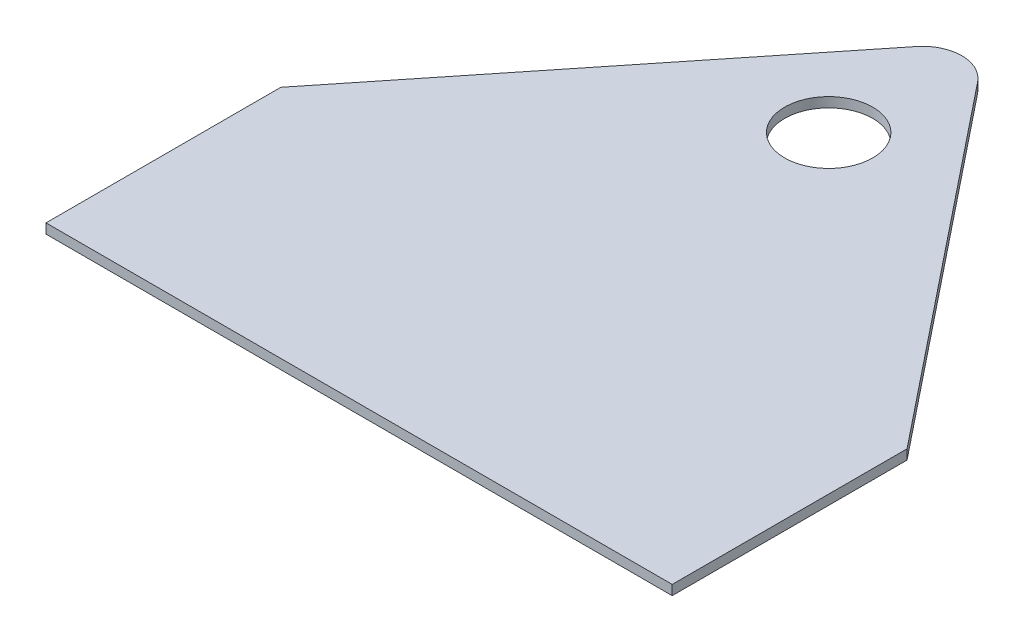
ISO-10303-21;
HEADER;
FILE_DESCRIPTION(('STEP AP214'),'2;1');
FILE_NAME('part.step','',(''),(''),'','','');
FILE_SCHEMA(('AUTOMOTIVE_DESIGN { 1 0 10303 214 1 1 1 1 }'));
ENDSEC;
DATA;
#1=APPLICATION_CONTEXT('core data for automotive mechanical design processes');
#2=APPLICATION_PROTOCOL_DEFINITION('international standard','automotive_design',2000,#1);
#3=PRODUCT_CONTEXT('',#1,'mechanical');
#4=PRODUCT('Part','Part','',(#3));
#5=PRODUCT_RELATED_PRODUCT_CATEGORY('part','',(#4));
#6=PRODUCT_DEFINITION_FORMATION('','',#4);
#7=PRODUCT_DEFINITION_CONTEXT('part definition',#1,'design');
#8=PRODUCT_DEFINITION('design','',#6,#7);
#9=PRODUCT_DEFINITION_SHAPE('','',#8);
#10=(LENGTH_UNIT() NAMED_UNIT(*) SI_UNIT(.MILLI.,.METRE.));
#11=(NAMED_UNIT(*) PLANE_ANGLE_UNIT() SI_UNIT($,.RADIAN.));
#12=(NAMED_UNIT(*) SI_UNIT($,.STERADIAN.) SOLID_ANGLE_UNIT());
#13=UNCERTAINTY_MEASURE_WITH_UNIT(LENGTH_MEASURE(1.E-05),#10,'distance_accuracy_value','');
#14=(GEOMETRIC_REPRESENTATION_CONTEXT(3) GLOBAL_UNCERTAINTY_ASSIGNED_CONTEXT((#13)) GLOBAL_UNIT_ASSIGNED_CONTEXT((#10,
#11,#12)) REPRESENTATION_CONTEXT('',''));
#15=CARTESIAN_POINT('',(0.,0.,0.));
#16=DIRECTION('',(0.,0.,1.));
#17=DIRECTION('',(1.,0.,0.));
#18=AXIS2_PLACEMENT_3D('',#15,#16,#17);
#19=CARTESIAN_POINT('',(101.6,1.5875,-76.2));
#20=DIRECTION('',(-1.,0.,0.));
#21=DIRECTION('',(0.,0.,1.));
#22=AXIS2_PLACEMENT_3D('',#19,#20,#21);
#23=PLANE('',#22);
#24=DIRECTION('',(0.,0.,-1.));
#25=VECTOR('',#24,1.);
#26=CARTESIAN_POINT('',(101.6,-1.5875,-76.2));
#27=LINE('',#26,#25);
#28=CARTESIAN_POINT('',(101.6,-1.5875,0.));
#29=VERTEX_POINT('',#28);
#30=CARTESIAN_POINT('',(101.6,-1.5875,-76.2));
#31=VERTEX_POINT('',#30);
#32=EDGE_CURVE('E116',#29,#31,#27,.T.);
#33=ORIENTED_EDGE('',*,*,#32,.T.);
#34=DIRECTION('',(0.,-1.,0.));
#35=VECTOR('',#34,1.);
#36=CARTESIAN_POINT('',(101.6,1.5875,-76.2));
#37=LINE('',#36,#35);
#38=CARTESIAN_POINT('',(101.6,1.5875,-76.2));
#39=VERTEX_POINT('',#38);
#40=EDGE_CURVE('E11',#39,#31,#37,.T.);
#41=ORIENTED_EDGE('',*,*,#40,.F.);
#42=DIRECTION('',(0.,0.,-1.));
#43=VECTOR('',#42,1.);
#44=CARTESIAN_POINT('',(101.6,1.5875,-76.2));
#45=LINE('',#44,#43);
#46=CARTESIAN_POINT('',(101.6,1.5875,0.));
#47=VERTEX_POINT('',#46);
#48=EDGE_CURVE('E127',#47,#39,#45,.T.);
#49=ORIENTED_EDGE('',*,*,#48,.F.);
#50=DIRECTION('',(0.,-1.,0.));
#51=VECTOR('',#50,1.);
#52=CARTESIAN_POINT('',(101.6,1.5875,0.));
#53=LINE('',#52,#51);
#54=EDGE_CURVE('E112',#47,#29,#53,.T.);
#55=ORIENTED_EDGE('',*,*,#54,.T.);
#56=EDGE_LOOP('',(#33,#41,#49,#55));
#57=FACE_BOUND('',#56,.T.);
#58=ADVANCED_FACE('F32',(#57),#23,.F.);
#59=CARTESIAN_POINT('',(9.91703387992652,1.5875,-190.803707650092));
#60=DIRECTION('',(-0.78086880944303,0.,0.624695047554424));
#61=DIRECTION('',(0.624695047554424,0.,0.78086880944303));
#62=AXIS2_PLACEMENT_3D('',#59,#60,#61);
#63=PLANE('',#62);
#64=DIRECTION('',(-0.624695047554424,0.,-0.78086880944303));
#65=VECTOR('',#64,1.);
#66=CARTESIAN_POINT('',(9.91703387992652,-1.5875,-190.803707650092));
#67=LINE('',#66,#65);
#68=CARTESIAN_POINT('',(9.91703387992653,-1.5875,-190.803707650092));
#69=VERTEX_POINT('',#68);
#70=EDGE_CURVE('E119',#31,#69,#67,.T.);
#71=ORIENTED_EDGE('',*,*,#70,.T.);
#72=DIRECTION('',(0.,-1.,0.));
#73=VECTOR('',#72,1.);
#74=CARTESIAN_POINT('',(9.91703387992653,1.5875,-190.803707650092));
#75=LINE('',#74,#73);
#76=CARTESIAN_POINT('',(9.91703387992653,1.5875,-190.803707650092));
#77=VERTEX_POINT('',#76);
#78=EDGE_CURVE('E40',#77,#69,#75,.T.);
#79=ORIENTED_EDGE('',*,*,#78,.F.);
#80=DIRECTION('',(-0.624695047554424,0.,-0.78086880944303));
#81=VECTOR('',#80,1.);
#82=CARTESIAN_POINT('',(9.91703387992652,1.5875,-190.803707650092));
#83=LINE('',#82,#81);
#84=EDGE_CURVE('E85',#39,#77,#83,.T.);
#85=ORIENTED_EDGE('',*,*,#84,.F.);
#86=ORIENTED_EDGE('',*,*,#40,.T.);
#87=EDGE_LOOP('',(#71,#79,#85,#86));
#88=FACE_BOUND('',#87,.T.);
#89=ADVANCED_FACE('F153',(#88),#63,.F.);
#90=CARTESIAN_POINT('',(0.,1.5875,-182.870080546151));
#91=DIRECTION('',(0.,-1.,0.));
#92=DIRECTION('',(0.,0.,-1.));
#93=AXIS2_PLACEMENT_3D('',#90,#91,#92);
#94=CYLINDRICAL_SURFACE('',#93,12.7);
#95=CARTESIAN_POINT('',(0.,-1.5875,-182.870080546151));
#96=DIRECTION('',(0.,1.,0.));
#97=DIRECTION('',(0.,0.,-1.));
#98=AXIS2_PLACEMENT_3D('',#95,#96,#97);
#99=CIRCLE('',#98,12.7);
#100=CARTESIAN_POINT('',(-9.91703387992659,-1.5875,-190.803707650092));
#101=VERTEX_POINT('',#100);
#102=EDGE_CURVE('E122',#69,#101,#99,.T.);
#103=ORIENTED_EDGE('',*,*,#102,.T.);
#104=DIRECTION('',(0.,-1.,0.));
#105=VECTOR('',#104,1.);
#106=CARTESIAN_POINT('',(-9.91703387992659,1.5875,-190.803707650092));
#107=LINE('',#106,#105);
#108=CARTESIAN_POINT('',(-9.91703387992659,1.5875,-190.803707650092));
#109=VERTEX_POINT('',#108);
#110=EDGE_CURVE('E107',#109,#101,#107,.T.);
#111=ORIENTED_EDGE('',*,*,#110,.F.);
#112=CARTESIAN_POINT('',(0.,1.5875,-182.870080546151));
#113=DIRECTION('',(0.,1.,0.));
#114=DIRECTION('',(0.,0.,-1.));
#115=AXIS2_PLACEMENT_3D('',#112,#113,#114);
#116=CIRCLE('',#115,12.7);
#117=EDGE_CURVE('E98',#77,#109,#116,.T.);
#118=ORIENTED_EDGE('',*,*,#117,.F.);
#119=ORIENTED_EDGE('',*,*,#78,.T.);
#120=EDGE_LOOP('',(#103,#111,#118,#119));
#121=FACE_BOUND('',#120,.T.);
#122=ADVANCED_FACE('F133',(#121),#94,.T.);
#123=CARTESIAN_POINT('',(-101.6,1.5875,-76.2));
#124=DIRECTION('',(0.78086880944303,0.,0.624695047554424));
#125=DIRECTION('',(0.624695047554424,0.,-0.78086880944303));
#126=AXIS2_PLACEMENT_3D('',#123,#124,#125);
#127=PLANE('',#126);
#128=DIRECTION('',(-0.624695047554424,0.,0.78086880944303));
#129=VECTOR('',#128,1.);
#130=CARTESIAN_POINT('',(-101.6,-1.5875,-76.2));
#131=LINE('',#130,#129);
#132=CARTESIAN_POINT('',(-101.6,-1.5875,-76.2));
#133=VERTEX_POINT('',#132);
#134=EDGE_CURVE('E106',#101,#133,#131,.T.);
#135=ORIENTED_EDGE('',*,*,#134,.T.);
#136=DIRECTION('',(0.,-1.,0.));
#137=VECTOR('',#136,1.);
#138=CARTESIAN_POINT('',(-101.6,1.5875,-76.2));
#139=LINE('',#138,#137);
#140=CARTESIAN_POINT('',(-101.6,1.5875,-76.2));
#141=VERTEX_POINT('',#140);
#142=EDGE_CURVE('E103',#141,#133,#139,.T.);
#143=ORIENTED_EDGE('',*,*,#142,.F.);
#144=DIRECTION('',(-0.624695047554424,0.,0.78086880944303));
#145=VECTOR('',#144,1.);
#146=CARTESIAN_POINT('',(-101.6,1.5875,-76.2));
#147=LINE('',#146,#145);
#148=EDGE_CURVE('E92',#109,#141,#147,.T.);
#149=ORIENTED_EDGE('',*,*,#148,.F.);
#150=ORIENTED_EDGE('',*,*,#110,.T.);
#151=EDGE_LOOP('',(#135,#143,#149,#150));
#152=FACE_BOUND('',#151,.T.);
#153=ADVANCED_FACE('F104',(#152),#127,.F.);
#154=CARTESIAN_POINT('',(-101.6,1.5875,0.));
#155=DIRECTION('',(1.,0.,0.));
#156=DIRECTION('',(0.,0.,-1.));
#157=AXIS2_PLACEMENT_3D('',#154,#155,#156);
#158=PLANE('',#157);
#159=DIRECTION('',(0.,0.,1.));
#160=VECTOR('',#159,1.);
#161=CARTESIAN_POINT('',(-101.6,-1.5875,0.));
#162=LINE('',#161,#160);
#163=CARTESIAN_POINT('',(-101.6,-1.5875,0.));
#164=VERTEX_POINT('',#163);
#165=EDGE_CURVE('E71',#133,#164,#162,.T.);
#166=ORIENTED_EDGE('',*,*,#165,.T.);
#167=DIRECTION('',(0.,-1.,0.));
#168=VECTOR('',#167,1.);
#169=CARTESIAN_POINT('',(-101.6,1.5875,0.));
#170=LINE('',#169,#168);
#171=CARTESIAN_POINT('',(-101.6,1.5875,0.));
#172=VERTEX_POINT('',#171);
#173=EDGE_CURVE('E108',#172,#164,#170,.T.);
#174=ORIENTED_EDGE('',*,*,#173,.F.);
#175=DIRECTION('',(0.,0.,1.));
#176=VECTOR('',#175,1.);
#177=CARTESIAN_POINT('',(-101.6,1.5875,0.));
#178=LINE('',#177,#176);
#179=EDGE_CURVE('E96',#141,#172,#178,.T.);
#180=ORIENTED_EDGE('',*,*,#179,.F.);
#181=ORIENTED_EDGE('',*,*,#142,.T.);
#182=EDGE_LOOP('',(#166,#174,#180,#181));
#183=FACE_BOUND('',#182,.T.);
#184=ADVANCED_FACE('F110',(#183),#158,.F.);
#185=CARTESIAN_POINT('',(-101.6,1.5875,0.));
#186=DIRECTION('',(0.,0.,-1.));
#187=DIRECTION('',(-1.,0.,0.));
#188=AXIS2_PLACEMENT_3D('',#185,#186,#187);
#189=PLANE('',#188);
#190=DIRECTION('',(1.,0.,0.));
#191=VECTOR('',#190,1.);
#192=CARTESIAN_POINT('',(-101.6,-1.5875,0.));
#193=LINE('',#192,#191);
#194=EDGE_CURVE('E77',#164,#29,#193,.T.);
#195=ORIENTED_EDGE('',*,*,#194,.T.);
#196=ORIENTED_EDGE('',*,*,#54,.F.);
#197=DIRECTION('',(1.,0.,0.));
#198=VECTOR('',#197,1.);
#199=CARTESIAN_POINT('',(-101.6,1.5875,0.));
#200=LINE('',#199,#198);
#201=EDGE_CURVE('E48',#172,#47,#200,.T.);
#202=ORIENTED_EDGE('',*,*,#201,.F.);
#203=ORIENTED_EDGE('',*,*,#173,.T.);
#204=EDGE_LOOP('',(#195,#196,#202,#203));
#205=FACE_BOUND('',#204,.T.);
#206=ADVANCED_FACE('F140',(#205),#189,.F.);
#207=CARTESIAN_POINT('',(0.,1.5875,-182.870080546151));
#208=DIRECTION('',(0.,-1.,0.));
#209=DIRECTION('',(0.,0.,-1.));
#210=AXIS2_PLACEMENT_3D('',#207,#208,#209);
#211=PLANE('',#210);
#212=CARTESIAN_POINT('',(0.,1.5875,-152.375201365377));
#213=DIRECTION('',(0.,1.,0.));
#214=DIRECTION('',(0.,0.,1.));
#215=AXIS2_PLACEMENT_3D('',#212,#213,#214);
#216=CIRCLE('',#215,14.2875);
#217=CARTESIAN_POINT('',(0.,1.5875,-138.087701365377));
#218=VERTEX_POINT('',#217);
#219=EDGE_CURVE('E120',#218,#218,#216,.T.);
#220=ORIENTED_EDGE('',*,*,#219,.F.);
#221=EDGE_LOOP('',(#220));
#222=FACE_BOUND('',#221,.T.);
#223=ORIENTED_EDGE('',*,*,#48,.T.);
#224=ORIENTED_EDGE('',*,*,#84,.T.);
#225=ORIENTED_EDGE('',*,*,#117,.T.);
#226=ORIENTED_EDGE('',*,*,#148,.T.);
#227=ORIENTED_EDGE('',*,*,#179,.T.);
#228=ORIENTED_EDGE('',*,*,#201,.T.);
#229=EDGE_LOOP('',(#223,#224,#225,#226,#227,#228));
#230=FACE_BOUND('',#229,.T.);
#231=ADVANCED_FACE('F94',(#222,#230),#211,.F.);
#232=CARTESIAN_POINT('',(0.,-1.5875,-182.870080546151));
#233=DIRECTION('',(0.,-1.,0.));
#234=DIRECTION('',(0.,0.,-1.));
#235=AXIS2_PLACEMENT_3D('',#232,#233,#234);
#236=PLANE('',#235);
#237=CARTESIAN_POINT('',(0.,-1.5875,-152.375201365377));
#238=DIRECTION('',(0.,-1.,0.));
#239=DIRECTION('',(0.,0.,-1.));
#240=AXIS2_PLACEMENT_3D('',#237,#238,#239);
#241=CIRCLE('',#240,14.2875);
#242=CARTESIAN_POINT('',(0.,-1.5875,-166.662701365377));
#243=VERTEX_POINT('',#242);
#244=EDGE_CURVE('E205',#243,#243,#241,.F.);
#245=ORIENTED_EDGE('',*,*,#244,.T.);
#246=EDGE_LOOP('',(#245));
#247=FACE_BOUND('',#246,.T.);
#248=ORIENTED_EDGE('',*,*,#32,.F.);
#249=ORIENTED_EDGE('',*,*,#194,.F.);
#250=ORIENTED_EDGE('',*,*,#165,.F.);
#251=ORIENTED_EDGE('',*,*,#134,.F.);
#252=ORIENTED_EDGE('',*,*,#102,.F.);
#253=ORIENTED_EDGE('',*,*,#70,.F.);
#254=EDGE_LOOP('',(#248,#249,#250,#251,#252,#253));
#255=FACE_BOUND('',#254,.T.);
#256=ADVANCED_FACE('F136',(#247,#255),#236,.T.);
#257=CARTESIAN_POINT('',(0.,-1.5885,-152.375201365377));
#258=DIRECTION('',(0.,1.,0.));
#259=DIRECTION('',(0.,0.,1.));
#260=AXIS2_PLACEMENT_3D('',#257,#258,#259);
#261=CYLINDRICAL_SURFACE('',#260,14.2875);
#262=ORIENTED_EDGE('',*,*,#244,.F.);
#263=EDGE_LOOP('',(#262));
#264=FACE_BOUND('',#263,.T.);
#265=ORIENTED_EDGE('',*,*,#219,.T.);
#266=EDGE_LOOP('',(#265));
#267=FACE_BOUND('',#266,.T.);
#268=ADVANCED_FACE('F186',(#264,#267),#261,.F.);
#269=CLOSED_SHELL('',(#58,#89,#122,#153,#184,#206,#231,#256,#268));
#270=MANIFOLD_SOLID_BREP('B2',#269);
#271=ADVANCED_BREP_SHAPE_REPRESENTATION('',(#18,#270),#14);
#272=SHAPE_DEFINITION_REPRESENTATION(#9,#271);
ENDSEC;
END-ISO-10303-21;
